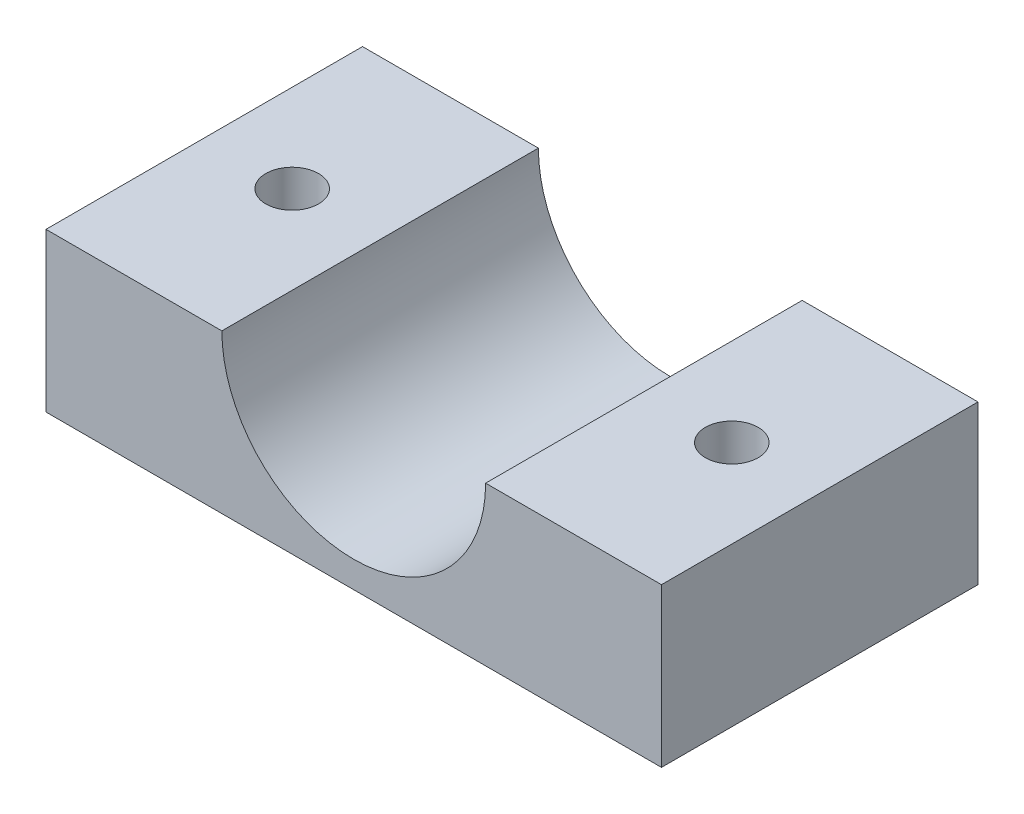
ISO-10303-21;
HEADER;
FILE_DESCRIPTION(('STEP AP214'),'2;1');
FILE_NAME('part.step','',(''),(''),'','','');
FILE_SCHEMA(('AUTOMOTIVE_DESIGN { 1 0 10303 214 1 1 1 1 }'));
ENDSEC;
DATA;
#1=APPLICATION_CONTEXT('core data for automotive mechanical design processes');
#2=APPLICATION_PROTOCOL_DEFINITION('international standard','automotive_design',2000,#1);
#3=PRODUCT_CONTEXT('',#1,'mechanical');
#4=PRODUCT('Part','Part','',(#3));
#5=PRODUCT_RELATED_PRODUCT_CATEGORY('part','',(#4));
#6=PRODUCT_DEFINITION_FORMATION('','',#4);
#7=PRODUCT_DEFINITION_CONTEXT('part definition',#1,'design');
#8=PRODUCT_DEFINITION('design','',#6,#7);
#9=PRODUCT_DEFINITION_SHAPE('','',#8);
#10=(LENGTH_UNIT() NAMED_UNIT(*) SI_UNIT(.MILLI.,.METRE.));
#11=(NAMED_UNIT(*) PLANE_ANGLE_UNIT() SI_UNIT($,.RADIAN.));
#12=(NAMED_UNIT(*) SI_UNIT($,.STERADIAN.) SOLID_ANGLE_UNIT());
#13=UNCERTAINTY_MEASURE_WITH_UNIT(LENGTH_MEASURE(1.E-05),#10,'distance_accuracy_value','');
#14=(GEOMETRIC_REPRESENTATION_CONTEXT(3) GLOBAL_UNCERTAINTY_ASSIGNED_CONTEXT((#13)) GLOBAL_UNIT_ASSIGNED_CONTEXT((#10,
#11,#12)) REPRESENTATION_CONTEXT('',''));
#15=CARTESIAN_POINT('',(0.,0.,0.));
#16=DIRECTION('',(0.,0.,1.));
#17=DIRECTION('',(1.,0.,0.));
#18=AXIS2_PLACEMENT_3D('',#15,#16,#17);
#19=CARTESIAN_POINT('',(0.,9.,0.));
#20=DIRECTION('',(0.,-1.,0.));
#21=DIRECTION('',(0.,0.,-1.));
#22=AXIS2_PLACEMENT_3D('',#19,#20,#21);
#23=PLANE('',#22);
#24=CARTESIAN_POINT('',(12.5,9.,0.));
#25=DIRECTION('',(0.,1.,0.));
#26=DIRECTION('',(0.,0.,-1.));
#27=AXIS2_PLACEMENT_3D('',#24,#25,#26);
#28=CIRCLE('',#27,1.5);
#29=CARTESIAN_POINT('',(12.5,9.,-1.5));
#30=VERTEX_POINT('',#29);
#31=EDGE_CURVE('E143',#30,#30,#28,.T.);
#32=ORIENTED_EDGE('',*,*,#31,.F.);
#33=EDGE_LOOP('',(#32));
#34=FACE_BOUND('',#33,.T.);
#35=DIRECTION('',(-1.,0.,0.));
#36=VECTOR('',#35,1.);
#37=CARTESIAN_POINT('',(-17.5,9.,-9.));
#38=LINE('',#37,#36);
#39=CARTESIAN_POINT('',(17.5,9.,-9.));
#40=VERTEX_POINT('',#39);
#41=CARTESIAN_POINT('',(7.5,9.,-9.));
#42=VERTEX_POINT('',#41);
#43=EDGE_CURVE('E86',#40,#42,#38,.T.);
#44=ORIENTED_EDGE('',*,*,#43,.T.);
#45=DIRECTION('',(0.,0.,1.));
#46=VECTOR('',#45,1.);
#47=CARTESIAN_POINT('',(7.5,9.,-9.001));
#48=LINE('',#47,#46);
#49=CARTESIAN_POINT('',(7.5,9.,9.));
#50=VERTEX_POINT('',#49);
#51=EDGE_CURVE('E96',#50,#42,#48,.F.);
#52=ORIENTED_EDGE('',*,*,#51,.F.);
#53=DIRECTION('',(1.,0.,0.));
#54=VECTOR('',#53,1.);
#55=CARTESIAN_POINT('',(-17.5,9.,9.));
#56=LINE('',#55,#54);
#57=CARTESIAN_POINT('',(17.5,9.,9.));
#58=VERTEX_POINT('',#57);
#59=EDGE_CURVE('E57',#50,#58,#56,.T.);
#60=ORIENTED_EDGE('',*,*,#59,.T.);
#61=DIRECTION('',(0.,0.,-1.));
#62=VECTOR('',#61,1.);
#63=CARTESIAN_POINT('',(17.5,9.,9.));
#64=LINE('',#63,#62);
#65=EDGE_CURVE('E120',#58,#40,#64,.T.);
#66=ORIENTED_EDGE('',*,*,#65,.T.);
#67=EDGE_LOOP('',(#44,#52,#60,#66));
#68=FACE_BOUND('',#67,.T.);
#69=ADVANCED_FACE('F33',(#34,#68),#23,.F.);
#70=CARTESIAN_POINT('',(-17.5,9.,9.));
#71=VERTEX_POINT('',#70);
#72=CARTESIAN_POINT('',(-7.5,9.,9.));
#73=VERTEX_POINT('',#72);
#74=EDGE_CURVE('E105',#71,#73,#56,.T.);
#75=ORIENTED_EDGE('',*,*,#74,.T.);
#76=DIRECTION('',(0.,0.,1.));
#77=VECTOR('',#76,1.);
#78=CARTESIAN_POINT('',(-7.5,9.,-9.001));
#79=LINE('',#78,#77);
#80=CARTESIAN_POINT('',(-7.5,9.,-9.));
#81=VERTEX_POINT('',#80);
#82=EDGE_CURVE('E48',#81,#73,#79,.T.);
#83=ORIENTED_EDGE('',*,*,#82,.F.);
#84=CARTESIAN_POINT('',(-17.5,9.,-9.));
#85=VERTEX_POINT('',#84);
#86=EDGE_CURVE('E137',#81,#85,#38,.T.);
#87=ORIENTED_EDGE('',*,*,#86,.T.);
#88=DIRECTION('',(0.,0.,1.));
#89=VECTOR('',#88,1.);
#90=CARTESIAN_POINT('',(-17.5,9.,9.));
#91=LINE('',#90,#89);
#92=EDGE_CURVE('E106',#85,#71,#91,.T.);
#93=ORIENTED_EDGE('',*,*,#92,.T.);
#94=EDGE_LOOP('',(#75,#83,#87,#93));
#95=FACE_BOUND('',#94,.T.);
#96=CARTESIAN_POINT('',(-12.5,9.,0.));
#97=DIRECTION('',(0.,1.,0.));
#98=DIRECTION('',(0.,0.,1.));
#99=AXIS2_PLACEMENT_3D('',#96,#97,#98);
#100=CIRCLE('',#99,1.5);
#101=CARTESIAN_POINT('',(-12.5,9.,1.5));
#102=VERTEX_POINT('',#101);
#103=EDGE_CURVE('E115',#102,#102,#100,.T.);
#104=ORIENTED_EDGE('',*,*,#103,.F.);
#105=EDGE_LOOP('',(#104));
#106=FACE_BOUND('',#105,.T.);
#107=ADVANCED_FACE('F153',(#95,#106),#23,.F.);
#108=CARTESIAN_POINT('',(0.,0.,0.));
#109=DIRECTION('',(0.,-1.,0.));
#110=DIRECTION('',(0.,0.,-1.));
#111=AXIS2_PLACEMENT_3D('',#108,#109,#110);
#112=PLANE('',#111);
#113=CARTESIAN_POINT('',(-12.5,0.,0.));
#114=DIRECTION('',(0.,1.,0.));
#115=DIRECTION('',(0.,0.,1.));
#116=AXIS2_PLACEMENT_3D('',#113,#114,#115);
#117=CIRCLE('',#116,1.5);
#118=CARTESIAN_POINT('',(-12.5,0.,1.5));
#119=VERTEX_POINT('',#118);
#120=EDGE_CURVE('E140',#119,#119,#117,.T.);
#121=ORIENTED_EDGE('',*,*,#120,.T.);
#122=EDGE_LOOP('',(#121));
#123=FACE_BOUND('',#122,.T.);
#124=DIRECTION('',(0.,0.,-1.));
#125=VECTOR('',#124,1.);
#126=CARTESIAN_POINT('',(17.5,0.,9.));
#127=LINE('',#126,#125);
#128=CARTESIAN_POINT('',(17.5,0.,9.));
#129=VERTEX_POINT('',#128);
#130=CARTESIAN_POINT('',(17.5,0.,-9.));
#131=VERTEX_POINT('',#130);
#132=EDGE_CURVE('E111',#129,#131,#127,.T.);
#133=ORIENTED_EDGE('',*,*,#132,.F.);
#134=DIRECTION('',(1.,0.,0.));
#135=VECTOR('',#134,1.);
#136=CARTESIAN_POINT('',(-17.5,0.,9.));
#137=LINE('',#136,#135);
#138=CARTESIAN_POINT('',(-17.5,0.,9.));
#139=VERTEX_POINT('',#138);
#140=EDGE_CURVE('E79',#139,#129,#137,.T.);
#141=ORIENTED_EDGE('',*,*,#140,.F.);
#142=DIRECTION('',(0.,0.,1.));
#143=VECTOR('',#142,1.);
#144=CARTESIAN_POINT('',(-17.5,0.,9.));
#145=LINE('',#144,#143);
#146=CARTESIAN_POINT('',(-17.5,0.,-9.));
#147=VERTEX_POINT('',#146);
#148=EDGE_CURVE('E117',#147,#139,#145,.T.);
#149=ORIENTED_EDGE('',*,*,#148,.F.);
#150=DIRECTION('',(-1.,0.,0.));
#151=VECTOR('',#150,1.);
#152=CARTESIAN_POINT('',(-17.5,0.,-9.));
#153=LINE('',#152,#151);
#154=EDGE_CURVE('E114',#131,#147,#153,.T.);
#155=ORIENTED_EDGE('',*,*,#154,.F.);
#156=EDGE_LOOP('',(#133,#141,#149,#155));
#157=FACE_BOUND('',#156,.T.);
#158=CARTESIAN_POINT('',(12.5,0.,0.));
#159=DIRECTION('',(0.,1.,0.));
#160=DIRECTION('',(0.,0.,-1.));
#161=AXIS2_PLACEMENT_3D('',#158,#159,#160);
#162=CIRCLE('',#161,1.5);
#163=CARTESIAN_POINT('',(12.5,0.,-1.5));
#164=VERTEX_POINT('',#163);
#165=EDGE_CURVE('E146',#164,#164,#162,.T.);
#166=ORIENTED_EDGE('',*,*,#165,.T.);
#167=EDGE_LOOP('',(#166));
#168=FACE_BOUND('',#167,.T.);
#169=ADVANCED_FACE('F133',(#123,#157,#168),#112,.T.);
#170=CARTESIAN_POINT('',(17.5,9.,9.));
#171=DIRECTION('',(-1.,0.,0.));
#172=DIRECTION('',(0.,0.,1.));
#173=AXIS2_PLACEMENT_3D('',#170,#171,#172);
#174=PLANE('',#173);
#175=ORIENTED_EDGE('',*,*,#132,.T.);
#176=DIRECTION('',(0.,-1.,0.));
#177=VECTOR('',#176,1.);
#178=CARTESIAN_POINT('',(17.5,9.,-9.));
#179=LINE('',#178,#177);
#180=EDGE_CURVE('E11',#40,#131,#179,.T.);
#181=ORIENTED_EDGE('',*,*,#180,.F.);
#182=ORIENTED_EDGE('',*,*,#65,.F.);
#183=DIRECTION('',(0.,-1.,0.));
#184=VECTOR('',#183,1.);
#185=CARTESIAN_POINT('',(17.5,9.,9.));
#186=LINE('',#185,#184);
#187=EDGE_CURVE('E103',#58,#129,#186,.T.);
#188=ORIENTED_EDGE('',*,*,#187,.T.);
#189=EDGE_LOOP('',(#175,#181,#182,#188));
#190=FACE_BOUND('',#189,.T.);
#191=ADVANCED_FACE('F35',(#190),#174,.F.);
#192=CARTESIAN_POINT('',(-17.5,9.,-9.));
#193=DIRECTION('',(0.,0.,1.));
#194=DIRECTION('',(1.,0.,0.));
#195=AXIS2_PLACEMENT_3D('',#192,#193,#194);
#196=PLANE('',#195);
#197=ORIENTED_EDGE('',*,*,#86,.F.);
#198=CARTESIAN_POINT('',(0.,9.,-9.));
#199=DIRECTION('',(0.,0.,1.));
#200=DIRECTION('',(1.,0.,0.));
#201=AXIS2_PLACEMENT_3D('',#198,#199,#200);
#202=CIRCLE('',#201,7.5);
#203=EDGE_CURVE('E99',#42,#81,#202,.F.);
#204=ORIENTED_EDGE('',*,*,#203,.F.);
#205=ORIENTED_EDGE('',*,*,#43,.F.);
#206=ORIENTED_EDGE('',*,*,#180,.T.);
#207=ORIENTED_EDGE('',*,*,#154,.T.);
#208=DIRECTION('',(0.,-1.,0.));
#209=VECTOR('',#208,1.);
#210=CARTESIAN_POINT('',(-17.5,9.,-9.));
#211=LINE('',#210,#209);
#212=EDGE_CURVE('E41',#85,#147,#211,.T.);
#213=ORIENTED_EDGE('',*,*,#212,.F.);
#214=EDGE_LOOP('',(#197,#204,#205,#206,#207,#213));
#215=FACE_BOUND('',#214,.T.);
#216=ADVANCED_FACE('F155',(#215),#196,.F.);
#217=CARTESIAN_POINT('',(-17.5,9.,9.));
#218=DIRECTION('',(1.,0.,0.));
#219=DIRECTION('',(0.,0.,-1.));
#220=AXIS2_PLACEMENT_3D('',#217,#218,#219);
#221=PLANE('',#220);
#222=ORIENTED_EDGE('',*,*,#148,.T.);
#223=DIRECTION('',(0.,-1.,0.));
#224=VECTOR('',#223,1.);
#225=CARTESIAN_POINT('',(-17.5,9.,9.));
#226=LINE('',#225,#224);
#227=EDGE_CURVE('E122',#71,#139,#226,.T.);
#228=ORIENTED_EDGE('',*,*,#227,.F.);
#229=ORIENTED_EDGE('',*,*,#92,.F.);
#230=ORIENTED_EDGE('',*,*,#212,.T.);
#231=EDGE_LOOP('',(#222,#228,#229,#230));
#232=FACE_BOUND('',#231,.T.);
#233=ADVANCED_FACE('F128',(#232),#221,.F.);
#234=CARTESIAN_POINT('',(-17.5,9.,9.));
#235=DIRECTION('',(0.,0.,-1.));
#236=DIRECTION('',(-1.,0.,0.));
#237=AXIS2_PLACEMENT_3D('',#234,#235,#236);
#238=PLANE('',#237);
#239=ORIENTED_EDGE('',*,*,#59,.F.);
#240=CARTESIAN_POINT('',(0.,9.,9.));
#241=DIRECTION('',(0.,0.,1.));
#242=DIRECTION('',(1.,0.,0.));
#243=AXIS2_PLACEMENT_3D('',#240,#241,#242);
#244=CIRCLE('',#243,7.5);
#245=EDGE_CURVE('E94',#73,#50,#244,.T.);
#246=ORIENTED_EDGE('',*,*,#245,.F.);
#247=ORIENTED_EDGE('',*,*,#74,.F.);
#248=ORIENTED_EDGE('',*,*,#227,.T.);
#249=ORIENTED_EDGE('',*,*,#140,.T.);
#250=ORIENTED_EDGE('',*,*,#187,.F.);
#251=EDGE_LOOP('',(#239,#246,#247,#248,#249,#250));
#252=FACE_BOUND('',#251,.T.);
#253=ADVANCED_FACE('F102',(#252),#238,.F.);
#254=CARTESIAN_POINT('',(-12.5,9.,0.));
#255=DIRECTION('',(0.,-1.,0.));
#256=DIRECTION('',(0.,0.,-1.));
#257=AXIS2_PLACEMENT_3D('',#254,#255,#256);
#258=CYLINDRICAL_SURFACE('',#257,1.5);
#259=ORIENTED_EDGE('',*,*,#103,.T.);
#260=EDGE_LOOP('',(#259));
#261=FACE_BOUND('',#260,.T.);
#262=ORIENTED_EDGE('',*,*,#120,.F.);
#263=EDGE_LOOP('',(#262));
#264=FACE_BOUND('',#263,.T.);
#265=ADVANCED_FACE('F171',(#261,#264),#258,.F.);
#266=CARTESIAN_POINT('',(12.5,9.,0.));
#267=DIRECTION('',(0.,-1.,0.));
#268=DIRECTION('',(0.,0.,-1.));
#269=AXIS2_PLACEMENT_3D('',#266,#267,#268);
#270=CYLINDRICAL_SURFACE('',#269,1.5);
#271=ORIENTED_EDGE('',*,*,#31,.T.);
#272=EDGE_LOOP('',(#271));
#273=FACE_BOUND('',#272,.T.);
#274=ORIENTED_EDGE('',*,*,#165,.F.);
#275=EDGE_LOOP('',(#274));
#276=FACE_BOUND('',#275,.T.);
#277=ADVANCED_FACE('F180',(#273,#276),#270,.F.);
#278=CARTESIAN_POINT('',(0.,9.,-9.001));
#279=DIRECTION('',(0.,0.,1.));
#280=DIRECTION('',(1.,0.,0.));
#281=AXIS2_PLACEMENT_3D('',#278,#279,#280);
#282=CYLINDRICAL_SURFACE('',#281,7.5);
#283=ORIENTED_EDGE('',*,*,#51,.T.);
#284=ORIENTED_EDGE('',*,*,#203,.T.);
#285=ORIENTED_EDGE('',*,*,#82,.T.);
#286=ORIENTED_EDGE('',*,*,#245,.T.);
#287=EDGE_LOOP('',(#283,#284,#285,#286));
#288=FACE_BOUND('',#287,.T.);
#289=ADVANCED_FACE('F95',(#288),#282,.F.);
#290=CLOSED_SHELL('',(#69,#107,#169,#191,#216,#233,#253,#265,#277,#289));
#291=MANIFOLD_SOLID_BREP('B2',#290);
#292=ADVANCED_BREP_SHAPE_REPRESENTATION('',(#18,#291),#14);
#293=SHAPE_DEFINITION_REPRESENTATION(#9,#292);
ENDSEC;
END-ISO-10303-21;
